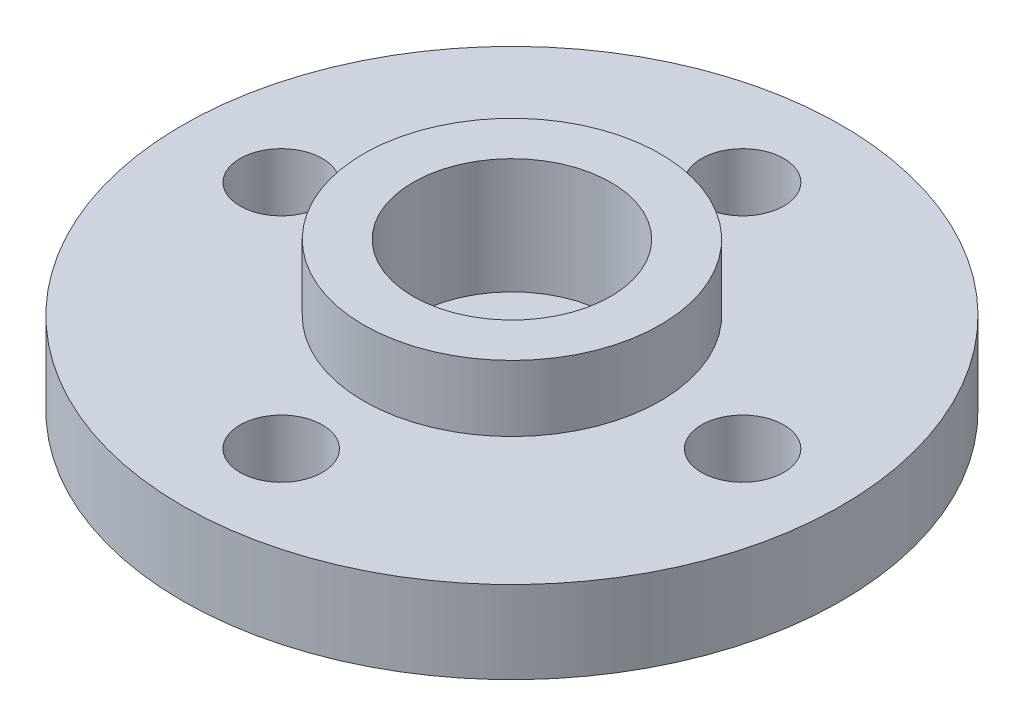
ISO-10303-21;
HEADER;
FILE_DESCRIPTION(('STEP AP214'),'2;1');
FILE_NAME('part.step','',(''),(''),'','','');
FILE_SCHEMA(('AUTOMOTIVE_DESIGN { 1 0 10303 214 1 1 1 1 }'));
ENDSEC;
DATA;
#1=APPLICATION_CONTEXT('core data for automotive mechanical design processes');
#2=APPLICATION_PROTOCOL_DEFINITION('international standard','automotive_design',2000,#1);
#3=PRODUCT_CONTEXT('',#1,'mechanical');
#4=PRODUCT('Part','Part','',(#3));
#5=PRODUCT_RELATED_PRODUCT_CATEGORY('part','',(#4));
#6=PRODUCT_DEFINITION_FORMATION('','',#4);
#7=PRODUCT_DEFINITION_CONTEXT('part definition',#1,'design');
#8=PRODUCT_DEFINITION('design','',#6,#7);
#9=PRODUCT_DEFINITION_SHAPE('','',#8);
#10=(LENGTH_UNIT() NAMED_UNIT(*) SI_UNIT(.MILLI.,.METRE.));
#11=(NAMED_UNIT(*) PLANE_ANGLE_UNIT() SI_UNIT($,.RADIAN.));
#12=(NAMED_UNIT(*) SI_UNIT($,.STERADIAN.) SOLID_ANGLE_UNIT());
#13=UNCERTAINTY_MEASURE_WITH_UNIT(LENGTH_MEASURE(1.E-05),#10,'distance_accuracy_value','');
#14=(GEOMETRIC_REPRESENTATION_CONTEXT(3) GLOBAL_UNCERTAINTY_ASSIGNED_CONTEXT((#13)) GLOBAL_UNIT_ASSIGNED_CONTEXT((#10,
#11,#12)) REPRESENTATION_CONTEXT('',''));
#15=CARTESIAN_POINT('',(0.,0.,0.));
#16=DIRECTION('',(0.,0.,1.));
#17=DIRECTION('',(1.,0.,0.));
#18=AXIS2_PLACEMENT_3D('',#15,#16,#17);
#19=CARTESIAN_POINT('',(0.,4.5,-4.5));
#20=DIRECTION('',(0.,-1.,0.));
#21=DIRECTION('',(0.,0.,-1.));
#22=AXIS2_PLACEMENT_3D('',#19,#20,#21);
#23=PLANE('',#22);
#24=CARTESIAN_POINT('',(0.,4.5,0.));
#25=DIRECTION('',(0.,1.,0.));
#26=DIRECTION('',(0.,0.,1.));
#27=AXIS2_PLACEMENT_3D('',#24,#25,#26);
#28=CIRCLE('',#27,3.);
#29=CARTESIAN_POINT('',(0.,4.5,3.));
#30=VERTEX_POINT('',#29);
#31=EDGE_CURVE('E10',#30,#30,#28,.T.);
#32=ORIENTED_EDGE('',*,*,#31,.F.);
#33=EDGE_LOOP('',(#32));
#34=FACE_BOUND('',#33,.T.);
#35=CARTESIAN_POINT('',(0.,4.5,0.));
#36=DIRECTION('',(0.,1.,0.));
#37=DIRECTION('',(0.,0.,1.));
#38=AXIS2_PLACEMENT_3D('',#35,#36,#37);
#39=CIRCLE('',#38,4.5);
#40=CARTESIAN_POINT('',(0.,4.5,4.5));
#41=VERTEX_POINT('',#40);
#42=EDGE_CURVE('E61',#41,#41,#39,.T.);
#43=ORIENTED_EDGE('',*,*,#42,.T.);
#44=EDGE_LOOP('',(#43));
#45=FACE_BOUND('',#44,.T.);
#46=ADVANCED_FACE('F33',(#34,#45),#23,.F.);
#47=CARTESIAN_POINT('',(0.,12.5252525252525,0.));
#48=DIRECTION('',(0.,1.,0.));
#49=DIRECTION('',(0.,0.,1.));
#50=AXIS2_PLACEMENT_3D('',#47,#48,#49);
#51=CYLINDRICAL_SURFACE('',#50,3.);
#52=CARTESIAN_POINT('',(0.,1.,0.));
#53=DIRECTION('',(0.,1.,0.));
#54=DIRECTION('',(0.,0.,1.));
#55=AXIS2_PLACEMENT_3D('',#52,#53,#54);
#56=CIRCLE('',#55,3.);
#57=CARTESIAN_POINT('',(0.,1.,3.));
#58=VERTEX_POINT('',#57);
#59=EDGE_CURVE('E39',#58,#58,#56,.T.);
#60=ORIENTED_EDGE('',*,*,#59,.F.);
#61=EDGE_LOOP('',(#60));
#62=FACE_BOUND('',#61,.T.);
#63=ORIENTED_EDGE('',*,*,#31,.T.);
#64=EDGE_LOOP('',(#63));
#65=FACE_BOUND('',#64,.T.);
#66=ADVANCED_FACE('F127',(#62,#65),#51,.F.);
#67=CARTESIAN_POINT('',(0.,1.,-3.));
#68=DIRECTION('',(0.,-1.,0.));
#69=DIRECTION('',(0.,0.,-1.));
#70=AXIS2_PLACEMENT_3D('',#67,#68,#69);
#71=PLANE('',#70);
#72=CARTESIAN_POINT('',(0.,1.,0.));
#73=DIRECTION('',(0.,1.,0.));
#74=DIRECTION('',(0.,0.,1.));
#75=AXIS2_PLACEMENT_3D('',#72,#73,#74);
#76=CIRCLE('',#75,1.5);
#77=CARTESIAN_POINT('',(0.,1.,1.5));
#78=VERTEX_POINT('',#77);
#79=EDGE_CURVE('E43',#78,#78,#76,.T.);
#80=ORIENTED_EDGE('',*,*,#79,.F.);
#81=EDGE_LOOP('',(#80));
#82=FACE_BOUND('',#81,.T.);
#83=ORIENTED_EDGE('',*,*,#59,.T.);
#84=EDGE_LOOP('',(#83));
#85=FACE_BOUND('',#84,.T.);
#86=ADVANCED_FACE('F122',(#82,#85),#71,.F.);
#87=CARTESIAN_POINT('',(0.,12.5252525252525,0.));
#88=DIRECTION('',(0.,1.,0.));
#89=DIRECTION('',(0.,0.,1.));
#90=AXIS2_PLACEMENT_3D('',#87,#88,#89);
#91=CYLINDRICAL_SURFACE('',#90,1.5);
#92=CARTESIAN_POINT('',(0.,0.,0.));
#93=DIRECTION('',(0.,1.,0.));
#94=DIRECTION('',(0.,0.,1.));
#95=AXIS2_PLACEMENT_3D('',#92,#93,#94);
#96=CIRCLE('',#95,1.5);
#97=CARTESIAN_POINT('',(0.,0.,1.5));
#98=VERTEX_POINT('',#97);
#99=EDGE_CURVE('E47',#98,#98,#96,.T.);
#100=ORIENTED_EDGE('',*,*,#99,.F.);
#101=EDGE_LOOP('',(#100));
#102=FACE_BOUND('',#101,.T.);
#103=ORIENTED_EDGE('',*,*,#79,.T.);
#104=EDGE_LOOP('',(#103));
#105=FACE_BOUND('',#104,.T.);
#106=ADVANCED_FACE('F115',(#102,#105),#91,.F.);
#107=CARTESIAN_POINT('',(0.,0.,-1.5));
#108=DIRECTION('',(0.,1.,0.));
#109=DIRECTION('',(0.,0.,1.));
#110=AXIS2_PLACEMENT_3D('',#107,#108,#109);
#111=PLANE('',#110);
#112=CARTESIAN_POINT('',(0.,0.,-7.));
#113=DIRECTION('',(0.,1.,0.));
#114=DIRECTION('',(0.,0.,1.));
#115=AXIS2_PLACEMENT_3D('',#112,#113,#114);
#116=CIRCLE('',#115,1.25);
#117=CARTESIAN_POINT('',(0.,0.,-5.75));
#118=VERTEX_POINT('',#117);
#119=EDGE_CURVE('E82',#118,#118,#116,.T.);
#120=ORIENTED_EDGE('',*,*,#119,.T.);
#121=EDGE_LOOP('',(#120));
#122=FACE_BOUND('',#121,.T.);
#123=CARTESIAN_POINT('',(7.,0.,0.));
#124=DIRECTION('',(0.,1.,0.));
#125=DIRECTION('',(0.,0.,1.));
#126=AXIS2_PLACEMENT_3D('',#123,#124,#125);
#127=CIRCLE('',#126,1.25);
#128=CARTESIAN_POINT('',(7.,0.,1.25));
#129=VERTEX_POINT('',#128);
#130=EDGE_CURVE('E76',#129,#129,#127,.T.);
#131=ORIENTED_EDGE('',*,*,#130,.T.);
#132=EDGE_LOOP('',(#131));
#133=FACE_BOUND('',#132,.T.);
#134=CARTESIAN_POINT('',(0.,0.,7.));
#135=DIRECTION('',(0.,1.,0.));
#136=DIRECTION('',(0.,0.,1.));
#137=AXIS2_PLACEMENT_3D('',#134,#135,#136);
#138=CIRCLE('',#137,1.25);
#139=CARTESIAN_POINT('',(0.,0.,8.25));
#140=VERTEX_POINT('',#139);
#141=EDGE_CURVE('E70',#140,#140,#138,.T.);
#142=ORIENTED_EDGE('',*,*,#141,.T.);
#143=EDGE_LOOP('',(#142));
#144=FACE_BOUND('',#143,.T.);
#145=CARTESIAN_POINT('',(-7.,0.,0.));
#146=DIRECTION('',(0.,1.,0.));
#147=DIRECTION('',(0.,0.,1.));
#148=AXIS2_PLACEMENT_3D('',#145,#146,#147);
#149=CIRCLE('',#148,1.25);
#150=CARTESIAN_POINT('',(-7.,0.,1.25));
#151=VERTEX_POINT('',#150);
#152=EDGE_CURVE('E64',#151,#151,#149,.T.);
#153=ORIENTED_EDGE('',*,*,#152,.T.);
#154=EDGE_LOOP('',(#153));
#155=FACE_BOUND('',#154,.T.);
#156=CARTESIAN_POINT('',(0.,0.,0.));
#157=DIRECTION('',(0.,1.,0.));
#158=DIRECTION('',(0.,0.,1.));
#159=AXIS2_PLACEMENT_3D('',#156,#157,#158);
#160=CIRCLE('',#159,10.);
#161=CARTESIAN_POINT('',(0.,0.,10.));
#162=VERTEX_POINT('',#161);
#163=EDGE_CURVE('E52',#162,#162,#160,.T.);
#164=ORIENTED_EDGE('',*,*,#163,.F.);
#165=EDGE_LOOP('',(#164));
#166=FACE_BOUND('',#165,.T.);
#167=ORIENTED_EDGE('',*,*,#99,.T.);
#168=EDGE_LOOP('',(#167));
#169=FACE_BOUND('',#168,.T.);
#170=ADVANCED_FACE('F109',(#122,#133,#144,#155,#166,#169),#111,.F.);
#171=CARTESIAN_POINT('',(0.,12.5252525252525,0.));
#172=DIRECTION('',(0.,1.,0.));
#173=DIRECTION('',(0.,0.,1.));
#174=AXIS2_PLACEMENT_3D('',#171,#172,#173);
#175=CYLINDRICAL_SURFACE('',#174,10.);
#176=CARTESIAN_POINT('',(0.,2.5,0.));
#177=DIRECTION('',(0.,1.,0.));
#178=DIRECTION('',(0.,0.,1.));
#179=AXIS2_PLACEMENT_3D('',#176,#177,#178);
#180=CIRCLE('',#179,10.);
#181=CARTESIAN_POINT('',(0.,2.5,10.));
#182=VERTEX_POINT('',#181);
#183=EDGE_CURVE('E55',#182,#182,#180,.T.);
#184=ORIENTED_EDGE('',*,*,#183,.F.);
#185=EDGE_LOOP('',(#184));
#186=FACE_BOUND('',#185,.T.);
#187=ORIENTED_EDGE('',*,*,#163,.T.);
#188=EDGE_LOOP('',(#187));
#189=FACE_BOUND('',#188,.T.);
#190=ADVANCED_FACE('F95',(#186,#189),#175,.T.);
#191=CARTESIAN_POINT('',(0.,2.5,-10.));
#192=DIRECTION('',(0.,-1.,0.));
#193=DIRECTION('',(0.,0.,-1.));
#194=AXIS2_PLACEMENT_3D('',#191,#192,#193);
#195=PLANE('',#194);
#196=CARTESIAN_POINT('',(0.,2.5,-7.));
#197=DIRECTION('',(0.,1.,0.));
#198=DIRECTION('',(0.,0.,1.));
#199=AXIS2_PLACEMENT_3D('',#196,#197,#198);
#200=CIRCLE('',#199,1.24999999999999);
#201=CARTESIAN_POINT('',(0.,2.5,-5.75000000000001));
#202=VERTEX_POINT('',#201);
#203=EDGE_CURVE('E85',#202,#202,#200,.T.);
#204=ORIENTED_EDGE('',*,*,#203,.F.);
#205=EDGE_LOOP('',(#204));
#206=FACE_BOUND('',#205,.T.);
#207=CARTESIAN_POINT('',(7.,2.5,0.));
#208=DIRECTION('',(0.,1.,0.));
#209=DIRECTION('',(0.,0.,1.));
#210=AXIS2_PLACEMENT_3D('',#207,#208,#209);
#211=CIRCLE('',#210,1.24999999999999);
#212=CARTESIAN_POINT('',(7.,2.5,1.24999999999999));
#213=VERTEX_POINT('',#212);
#214=EDGE_CURVE('E79',#213,#213,#211,.T.);
#215=ORIENTED_EDGE('',*,*,#214,.F.);
#216=EDGE_LOOP('',(#215));
#217=FACE_BOUND('',#216,.T.);
#218=CARTESIAN_POINT('',(0.,2.5,7.));
#219=DIRECTION('',(0.,1.,0.));
#220=DIRECTION('',(0.,0.,1.));
#221=AXIS2_PLACEMENT_3D('',#218,#219,#220);
#222=CIRCLE('',#221,1.24999999999999);
#223=CARTESIAN_POINT('',(0.,2.5,8.24999999999999));
#224=VERTEX_POINT('',#223);
#225=EDGE_CURVE('E73',#224,#224,#222,.T.);
#226=ORIENTED_EDGE('',*,*,#225,.F.);
#227=EDGE_LOOP('',(#226));
#228=FACE_BOUND('',#227,.T.);
#229=CARTESIAN_POINT('',(-7.,2.5,0.));
#230=DIRECTION('',(0.,1.,0.));
#231=DIRECTION('',(0.,0.,1.));
#232=AXIS2_PLACEMENT_3D('',#229,#230,#231);
#233=CIRCLE('',#232,1.24999999999999);
#234=CARTESIAN_POINT('',(-7.,2.5,1.24999999999999));
#235=VERTEX_POINT('',#234);
#236=EDGE_CURVE('E67',#235,#235,#233,.T.);
#237=ORIENTED_EDGE('',*,*,#236,.F.);
#238=EDGE_LOOP('',(#237));
#239=FACE_BOUND('',#238,.T.);
#240=CARTESIAN_POINT('',(0.,2.5,0.));
#241=DIRECTION('',(0.,1.,0.));
#242=DIRECTION('',(0.,0.,1.));
#243=AXIS2_PLACEMENT_3D('',#240,#241,#242);
#244=CIRCLE('',#243,4.5);
#245=CARTESIAN_POINT('',(0.,2.5,4.5));
#246=VERTEX_POINT('',#245);
#247=EDGE_CURVE('E58',#246,#246,#244,.T.);
#248=ORIENTED_EDGE('',*,*,#247,.F.);
#249=EDGE_LOOP('',(#248));
#250=FACE_BOUND('',#249,.T.);
#251=ORIENTED_EDGE('',*,*,#183,.T.);
#252=EDGE_LOOP('',(#251));
#253=FACE_BOUND('',#252,.T.);
#254=ADVANCED_FACE('F91',(#206,#217,#228,#239,#250,#253),#195,.F.);
#255=CARTESIAN_POINT('',(0.,12.5252525252525,0.));
#256=DIRECTION('',(0.,1.,0.));
#257=DIRECTION('',(0.,0.,1.));
#258=AXIS2_PLACEMENT_3D('',#255,#256,#257);
#259=CYLINDRICAL_SURFACE('',#258,4.5);
#260=ORIENTED_EDGE('',*,*,#42,.F.);
#261=EDGE_LOOP('',(#260));
#262=FACE_BOUND('',#261,.T.);
#263=ORIENTED_EDGE('',*,*,#247,.T.);
#264=EDGE_LOOP('',(#263));
#265=FACE_BOUND('',#264,.T.);
#266=ADVANCED_FACE('F94',(#262,#265),#259,.T.);
#267=CARTESIAN_POINT('',(-7.,2.5,0.));
#268=DIRECTION('',(0.,1.,0.));
#269=DIRECTION('',(0.,0.,1.));
#270=AXIS2_PLACEMENT_3D('',#267,#268,#269);
#271=CYLINDRICAL_SURFACE('',#270,1.24999999999999);
#272=ORIENTED_EDGE('',*,*,#152,.F.);
#273=EDGE_LOOP('',(#272));
#274=FACE_BOUND('',#273,.T.);
#275=ORIENTED_EDGE('',*,*,#236,.T.);
#276=EDGE_LOOP('',(#275));
#277=FACE_BOUND('',#276,.T.);
#278=ADVANCED_FACE('F142',(#274,#277),#271,.F.);
#279=CARTESIAN_POINT('',(0.,2.5,7.));
#280=DIRECTION('',(0.,1.,0.));
#281=DIRECTION('',(0.,0.,1.));
#282=AXIS2_PLACEMENT_3D('',#279,#280,#281);
#283=CYLINDRICAL_SURFACE('',#282,1.24999999999999);
#284=ORIENTED_EDGE('',*,*,#141,.F.);
#285=EDGE_LOOP('',(#284));
#286=FACE_BOUND('',#285,.T.);
#287=ORIENTED_EDGE('',*,*,#225,.T.);
#288=EDGE_LOOP('',(#287));
#289=FACE_BOUND('',#288,.T.);
#290=ADVANCED_FACE('F147',(#286,#289),#283,.F.);
#291=CARTESIAN_POINT('',(7.,2.5,0.));
#292=DIRECTION('',(0.,1.,0.));
#293=DIRECTION('',(0.,0.,1.));
#294=AXIS2_PLACEMENT_3D('',#291,#292,#293);
#295=CYLINDRICAL_SURFACE('',#294,1.24999999999999);
#296=ORIENTED_EDGE('',*,*,#130,.F.);
#297=EDGE_LOOP('',(#296));
#298=FACE_BOUND('',#297,.T.);
#299=ORIENTED_EDGE('',*,*,#214,.T.);
#300=EDGE_LOOP('',(#299));
#301=FACE_BOUND('',#300,.T.);
#302=ADVANCED_FACE('F153',(#298,#301),#295,.F.);
#303=CARTESIAN_POINT('',(0.,2.5,-7.));
#304=DIRECTION('',(0.,1.,0.));
#305=DIRECTION('',(0.,0.,1.));
#306=AXIS2_PLACEMENT_3D('',#303,#304,#305);
#307=CYLINDRICAL_SURFACE('',#306,1.24999999999999);
#308=ORIENTED_EDGE('',*,*,#119,.F.);
#309=EDGE_LOOP('',(#308));
#310=FACE_BOUND('',#309,.T.);
#311=ORIENTED_EDGE('',*,*,#203,.T.);
#312=EDGE_LOOP('',(#311));
#313=FACE_BOUND('',#312,.T.);
#314=ADVANCED_FACE('F89',(#310,#313),#307,.F.);
#315=CLOSED_SHELL('',(#46,#66,#86,#106,#170,#190,#254,#266,#278,#290,#302,#314));
#316=MANIFOLD_SOLID_BREP('B2',#315);
#317=ADVANCED_BREP_SHAPE_REPRESENTATION('',(#18,#316),#14);
#318=SHAPE_DEFINITION_REPRESENTATION(#9,#317);
ENDSEC;
END-ISO-10303-21;
